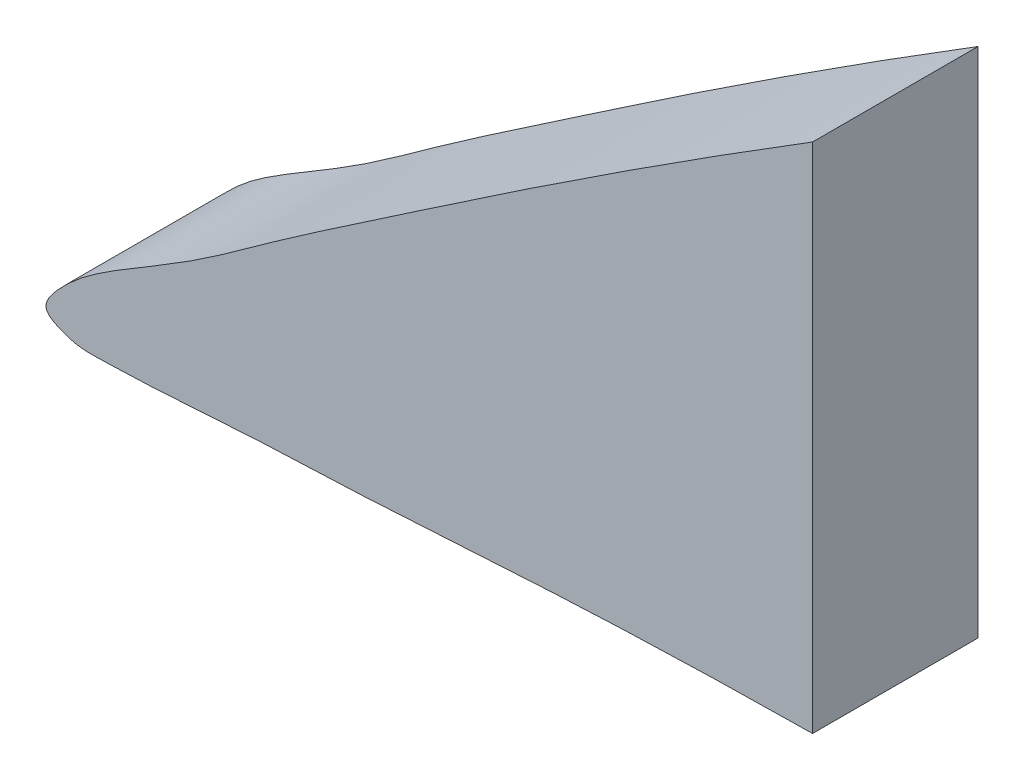
ISO-10303-21;
HEADER;
FILE_DESCRIPTION(('STEP AP214'),'2;1');
FILE_NAME('part.step','',(''),(''),'','','');
FILE_SCHEMA(('AUTOMOTIVE_DESIGN { 1 0 10303 214 1 1 1 1 }'));
ENDSEC;
DATA;
#1=APPLICATION_CONTEXT('core data for automotive mechanical design processes');
#2=APPLICATION_PROTOCOL_DEFINITION('international standard','automotive_design',2000,#1);
#3=PRODUCT_CONTEXT('',#1,'mechanical');
#4=PRODUCT('Part','Part','',(#3));
#5=PRODUCT_RELATED_PRODUCT_CATEGORY('part','',(#4));
#6=PRODUCT_DEFINITION_FORMATION('','',#4);
#7=PRODUCT_DEFINITION_CONTEXT('part definition',#1,'design');
#8=PRODUCT_DEFINITION('design','',#6,#7);
#9=PRODUCT_DEFINITION_SHAPE('','',#8);
#10=(LENGTH_UNIT() NAMED_UNIT(*) SI_UNIT(.MILLI.,.METRE.));
#11=(NAMED_UNIT(*) PLANE_ANGLE_UNIT() SI_UNIT($,.RADIAN.));
#12=(NAMED_UNIT(*) SI_UNIT($,.STERADIAN.) SOLID_ANGLE_UNIT());
#13=UNCERTAINTY_MEASURE_WITH_UNIT(LENGTH_MEASURE(1.E-05),#10,'distance_accuracy_value','');
#14=(GEOMETRIC_REPRESENTATION_CONTEXT(3) GLOBAL_UNCERTAINTY_ASSIGNED_CONTEXT((#13)) GLOBAL_UNIT_ASSIGNED_CONTEXT((#10,
#11,#12)) REPRESENTATION_CONTEXT('',''));
#15=CARTESIAN_POINT('',(0.,0.,0.));
#16=DIRECTION('',(0.,0.,1.));
#17=DIRECTION('',(1.,0.,0.));
#18=AXIS2_PLACEMENT_3D('',#15,#16,#17);
#19=CARTESIAN_POINT('',(-56.6234917582829,-97.9608096333666,67.9999999999997));
#20=CARTESIAN_POINT('',(-59.5744915806248,-99.7836436290035,67.9999999999997));
#21=CARTESIAN_POINT('',(-62.5021376636492,-101.643507558397,67.9999999999997));
#22=CARTESIAN_POINT('',(-66.86647201688,-104.476328630179,67.9999999999997));
#23=CARTESIAN_POINT('',(-68.3164332222966,-105.428019009509,67.9999999999997));
#24=CARTESIAN_POINT('',(-71.2051805666868,-107.34829764455,67.9999999999997));
#25=CARTESIAN_POINT('',(-72.6434915916945,-108.317496479384,67.9999999999997));
#26=CARTESIAN_POINT('',(-75.5157370914429,-110.262356447695,67.9999999999997));
#27=CARTESIAN_POINT('',(-76.9513853653781,-111.235489134058,67.9999999999997));
#28=CARTESIAN_POINT('',(-79.8212550175027,-113.183830597098,67.9999999999997));
#29=CARTESIAN_POINT('',(-81.2545367426772,-114.160416927023,67.9999999999997));
#30=CARTESIAN_POINT('',(-83.3775237699478,-115.664656086803,67.9999999999997));
#31=CARTESIAN_POINT('',(-84.0787918804106,-116.175740459933,67.9999999999997));
#32=CARTESIAN_POINT('',(-85.4940295082313,-117.178623737993,67.9999999999997));
#33=CARTESIAN_POINT('',(-86.2097999250049,-117.667644682045,67.9999999999997));
#34=CARTESIAN_POINT('',(-87.6711177567433,-118.600315001136,67.9999999999997));
#35=CARTESIAN_POINT('',(-88.4156813395914,-119.045463452961,67.9999999999997));
#36=CARTESIAN_POINT('',(-89.90651484269,-119.933160389862,67.9999999999997));
#37=CARTESIAN_POINT('',(-90.6528988314905,-120.37553506732,67.9999999999997));
#38=CARTESIAN_POINT('',(-91.7178541938546,-121.122323178092,67.9999999999997));
#39=CARTESIAN_POINT('',(-92.0610829880129,-121.38505757156,67.9999999999997));
#40=CARTESIAN_POINT('',(-92.7068696513712,-121.954560208893,67.9999999999997));
#41=CARTESIAN_POINT('',(-93.0136428003093,-122.257084977837,67.9999999999997));
#42=CARTESIAN_POINT('',(-93.3602862890812,-122.675840405858,67.9999999999997));
#43=CARTESIAN_POINT('',(-93.4274475093935,-122.762032978537,67.9999999999997));
#44=CARTESIAN_POINT('',(-93.5495582666548,-122.941327186733,67.9999999999997));
#45=CARTESIAN_POINT('',(-93.606126819416,-123.033797967433,67.9999999999997));
#46=CARTESIAN_POINT('',(-93.6907196604673,-123.236703179316,67.9999999999997));
#47=CARTESIAN_POINT('',(-93.716427792335,-123.348385745422,67.9999999999997));
#48=CARTESIAN_POINT('',(-93.6667845191537,-123.563802747294,67.9999999999997));
#49=CARTESIAN_POINT('',(-93.5916632018669,-123.651974656592,67.9999999999997));
#50=CARTESIAN_POINT('',(-93.422645771388,-123.792515955856,67.9999999999997));
#51=CARTESIAN_POINT('',(-93.3278627004112,-123.847783157767,67.9999999999997));
#52=CARTESIAN_POINT('',(-93.1323121417001,-123.94705295179,67.9999999999997));
#53=CARTESIAN_POINT('',(-93.0320919841695,-123.989946751266,67.9999999999997));
#54=CARTESIAN_POINT('',(-92.7278261731363,-124.108687393408,67.9999999999997));
#55=CARTESIAN_POINT('',(-92.5188733997911,-124.17430616941,67.9999999999997));
#56=CARTESIAN_POINT('',(-92.0926553255362,-124.268478418459,67.9999999999997));
#57=CARTESIAN_POINT('',(-91.8799360170612,-124.288685814427,67.9999999999997));
#58=CARTESIAN_POINT('',(-91.4549522456914,-124.29773090641,67.9999999999997));
#59=CARTESIAN_POINT('',(-91.2426280334319,-124.290689384796,67.9999999999997));
#60=CARTESIAN_POINT('',(-90.6056091095707,-124.272757138284,67.9999999999997));
#61=CARTESIAN_POINT('',(-90.1809225773565,-124.261302299015,67.9999999999997));
#62=CARTESIAN_POINT('',(-89.3316135123921,-124.233978718125,67.9999999999997));
#63=CARTESIAN_POINT('',(-88.9069922836724,-124.218020040379,67.9999999999997));
#64=CARTESIAN_POINT('',(-88.0579244808242,-124.174057141607,67.9999999999997));
#65=CARTESIAN_POINT('',(-87.6334474996334,-124.146554797078,67.9999999999997));
#66=CARTESIAN_POINT('',(-86.3602715400733,-124.059264188786,67.9999999999997));
#67=CARTESIAN_POINT('',(-85.5116897486167,-123.997215002471,67.9999999999997));
#68=CARTESIAN_POINT('',(-83.8134064704364,-123.894468358291,67.9999999999997));
#69=CARTESIAN_POINT('',(-82.963801308466,-123.851934061389,67.9999999999997));
#70=CARTESIAN_POINT('',(-81.2639710236446,-123.77868764525,67.9999999999997));
#71=CARTESIAN_POINT('',(-80.4137770279068,-123.747381955876,67.9999999999997));
#72=CARTESIAN_POINT('',(-78.713836212452,-123.676243273991,67.9999999999997));
#73=CARTESIAN_POINT('',(-77.8642011120687,-123.634027615639,67.9999999999997));
#74=CARTESIAN_POINT('',(-75.3163570264688,-123.489541681333,67.9999999999997));
#75=CARTESIAN_POINT('',(-73.6187926899221,-123.376515426061,67.9999999999997));
#76=CARTESIAN_POINT('',(-70.2224002284874,-123.171605184888,67.9999999999997));
#77=CARTESIAN_POINT('',(-68.523543254413,-123.079984707617,67.9999999999997));
#78=CARTESIAN_POINT('',(-63.4256916127023,-122.8597232535,67.9999999999997));
#79=CARTESIAN_POINT('',(-60.0252446383314,-122.776895756276,67.9999999999997));
#80=CARTESIAN_POINT('',(-56.6234917582631,-122.738552597859,67.9999999999997));
#81=B_SPLINE_CURVE_WITH_KNOTS('',3,(#19,#20,#21,#22,#23,#24,#25,#26,#27,#28,#29,#30,#31,#32,#33,
#34,#35,#36,#37,#38,#39,#40,#41,#42,#43,#44,#45,#46,#47,#48,#49,#50,#51,#52,#53,#54,#55,#56,#57,
#58,#59,#60,#61,#62,#63,#64,#65,#66,#67,#68,#69,#70,#71,#72,#73,#74,#75,#76,#77,#78,#79,#80),
.UNSPECIFIED.,.F.,.F.,(4,2,2,2,2,2,2,2,2,2,2,2,2,2,2,2,2,2,2,2,2,2,2,2,2,2,2,2,2,2,4),(0.,
0.125000000000001,0.187500000000001,0.250000000000001,0.312500000000001,0.375000000000001,
0.406250000000001,0.437500000000001,0.468750000000001,0.500000000000001,0.515625000000002,
0.531250000000002,0.535156250000002,0.539062500000001,0.542968750000001,0.546875000000001,
0.550781250000001,0.5546875,0.5625,0.5703125,0.578125000000001,0.593750000000001,
0.609375000000001,0.625000000000001,0.656250000000001,0.6875,0.71875,0.75,0.8125,0.875,1.),.UNSPECIFIED.);
#82=DIRECTION('',(0.,0.,-1.));
#83=VECTOR('',#82,1.);
#84=SURFACE_OF_LINEAR_EXTRUSION('',#81,#83);
#85=CARTESIAN_POINT('',(-56.6234917582829,-97.9608096333666,59.9999999999998));
#86=CARTESIAN_POINT('',(-59.5744915806248,-99.7836436290035,59.9999999999998));
#87=CARTESIAN_POINT('',(-62.5021376636492,-101.643507558397,59.9999999999998));
#88=CARTESIAN_POINT('',(-66.86647201688,-104.476328630179,59.9999999999998));
#89=CARTESIAN_POINT('',(-68.3164332222966,-105.428019009509,59.9999999999998));
#90=CARTESIAN_POINT('',(-71.2051805666868,-107.34829764455,59.9999999999998));
#91=CARTESIAN_POINT('',(-72.6434915916945,-108.317496479384,59.9999999999998));
#92=CARTESIAN_POINT('',(-75.5157370914429,-110.262356447695,59.9999999999998));
#93=CARTESIAN_POINT('',(-76.9513853653781,-111.235489134058,59.9999999999998));
#94=CARTESIAN_POINT('',(-79.8212550175027,-113.183830597098,59.9999999999998));
#95=CARTESIAN_POINT('',(-81.2545367426772,-114.160416927023,59.9999999999998));
#96=CARTESIAN_POINT('',(-83.3775237699478,-115.664656086803,59.9999999999998));
#97=CARTESIAN_POINT('',(-84.0787918804106,-116.175740459933,59.9999999999998));
#98=CARTESIAN_POINT('',(-85.4940295082313,-117.178623737993,59.9999999999998));
#99=CARTESIAN_POINT('',(-86.2097999250049,-117.667644682045,59.9999999999998));
#100=CARTESIAN_POINT('',(-87.6711177567433,-118.600315001136,59.9999999999998));
#101=CARTESIAN_POINT('',(-88.4156813395914,-119.045463452961,59.9999999999998));
#102=CARTESIAN_POINT('',(-89.90651484269,-119.933160389862,59.9999999999998));
#103=CARTESIAN_POINT('',(-90.6528988314905,-120.37553506732,59.9999999999998));
#104=CARTESIAN_POINT('',(-91.7178541938546,-121.122323178092,59.9999999999998));
#105=CARTESIAN_POINT('',(-92.0610829880129,-121.38505757156,59.9999999999998));
#106=CARTESIAN_POINT('',(-92.7068696513712,-121.954560208893,59.9999999999998));
#107=CARTESIAN_POINT('',(-93.0136428003093,-122.257084977837,59.9999999999998));
#108=CARTESIAN_POINT('',(-93.3602862890812,-122.675840405858,59.9999999999998));
#109=CARTESIAN_POINT('',(-93.4274475093935,-122.762032978537,59.9999999999998));
#110=CARTESIAN_POINT('',(-93.5495582666548,-122.941327186733,59.9999999999998));
#111=CARTESIAN_POINT('',(-93.606126819416,-123.033797967433,59.9999999999998));
#112=CARTESIAN_POINT('',(-93.6907196604673,-123.236703179316,59.9999999999998));
#113=CARTESIAN_POINT('',(-93.716427792335,-123.348385745422,59.9999999999998));
#114=CARTESIAN_POINT('',(-93.6667845191537,-123.563802747294,59.9999999999998));
#115=CARTESIAN_POINT('',(-93.5916632018669,-123.651974656592,59.9999999999998));
#116=CARTESIAN_POINT('',(-93.422645771388,-123.792515955856,59.9999999999998));
#117=CARTESIAN_POINT('',(-93.3278627004112,-123.847783157767,59.9999999999998));
#118=CARTESIAN_POINT('',(-93.1323121417001,-123.94705295179,59.9999999999998));
#119=CARTESIAN_POINT('',(-93.0320919841695,-123.989946751266,59.9999999999998));
#120=CARTESIAN_POINT('',(-92.7278261731363,-124.108687393408,59.9999999999998));
#121=CARTESIAN_POINT('',(-92.5188733997911,-124.17430616941,59.9999999999998));
#122=CARTESIAN_POINT('',(-92.0926553255362,-124.268478418459,59.9999999999998));
#123=CARTESIAN_POINT('',(-91.8799360170612,-124.288685814427,59.9999999999998));
#124=CARTESIAN_POINT('',(-91.4549522456914,-124.29773090641,59.9999999999998));
#125=CARTESIAN_POINT('',(-91.2426280334319,-124.290689384796,59.9999999999998));
#126=CARTESIAN_POINT('',(-90.6056091095707,-124.272757138284,59.9999999999998));
#127=CARTESIAN_POINT('',(-90.1809225773565,-124.261302299015,59.9999999999998));
#128=CARTESIAN_POINT('',(-89.3316135123921,-124.233978718125,59.9999999999998));
#129=CARTESIAN_POINT('',(-88.9069922836724,-124.218020040379,59.9999999999998));
#130=CARTESIAN_POINT('',(-88.0579244808242,-124.174057141607,59.9999999999998));
#131=CARTESIAN_POINT('',(-87.6334474996334,-124.146554797078,59.9999999999998));
#132=CARTESIAN_POINT('',(-86.3602715400733,-124.059264188786,59.9999999999998));
#133=CARTESIAN_POINT('',(-85.5116897486167,-123.997215002471,59.9999999999998));
#134=CARTESIAN_POINT('',(-83.8134064704364,-123.894468358291,59.9999999999998));
#135=CARTESIAN_POINT('',(-82.963801308466,-123.851934061389,59.9999999999998));
#136=CARTESIAN_POINT('',(-81.2639710236446,-123.77868764525,59.9999999999998));
#137=CARTESIAN_POINT('',(-80.4137770279068,-123.747381955876,59.9999999999998));
#138=CARTESIAN_POINT('',(-78.713836212452,-123.676243273991,59.9999999999998));
#139=CARTESIAN_POINT('',(-77.8642011120687,-123.634027615639,59.9999999999998));
#140=CARTESIAN_POINT('',(-75.3163570264688,-123.489541681333,59.9999999999998));
#141=CARTESIAN_POINT('',(-73.6187926899221,-123.376515426061,59.9999999999998));
#142=CARTESIAN_POINT('',(-70.2224002284874,-123.171605184888,59.9999999999998));
#143=CARTESIAN_POINT('',(-68.523543254413,-123.079984707617,59.9999999999998));
#144=CARTESIAN_POINT('',(-63.4256916127023,-122.8597232535,59.9999999999998));
#145=CARTESIAN_POINT('',(-60.0252446383314,-122.776895756276,59.9999999999998));
#146=CARTESIAN_POINT('',(-56.6234917582631,-122.738552597859,59.9999999999998));
#147=B_SPLINE_CURVE_WITH_KNOTS('',3,(#85,#86,#87,#88,#89,#90,#91,#92,#93,#94,#95,#96,#97,#98,
#99,#100,#101,#102,#103,#104,#105,#106,#107,#108,#109,#110,#111,#112,#113,#114,#115,#116,#117,
#118,#119,#120,#121,#122,#123,#124,#125,#126,#127,#128,#129,#130,#131,#132,#133,#134,#135,#136,
#137,#138,#139,#140,#141,#142,#143,#144,#145,#146),.UNSPECIFIED.,.F.,.F.,(4,2,2,2,2,2,2,2,2,2,2,
2,2,2,2,2,2,2,2,2,2,2,2,2,2,2,2,2,2,2,4),(0.,0.125000000000001,0.187500000000001,
0.250000000000001,0.312500000000001,0.375000000000001,0.406250000000001,0.437500000000001,
0.468750000000001,0.500000000000001,0.515625000000002,0.531250000000002,0.535156250000002,
0.539062500000001,0.542968750000001,0.546875000000001,0.550781250000001,0.5546875,0.5625,
0.5703125,0.578125000000001,0.593750000000001,0.609375000000001,0.625000000000001,
0.656250000000001,0.6875,0.71875,0.75,0.8125,0.875,1.),.UNSPECIFIED.);
#148=CARTESIAN_POINT('',(-56.6234917582641,-97.9608096333558,59.9999999999997));
#149=VERTEX_POINT('',#148);
#150=CARTESIAN_POINT('',(-56.6234917582631,-122.738552597859,59.9999999999997));
#151=VERTEX_POINT('',#150);
#152=EDGE_CURVE('E65',#149,#151,#147,.T.);
#153=ORIENTED_EDGE('',*,*,#152,.T.);
#154=DIRECTION('',(0.,0.,-1.));
#155=VECTOR('',#154,1.);
#156=CARTESIAN_POINT('',(-56.6234917582631,-122.738552597859,67.9999999999997));
#157=LINE('',#156,#155);
#158=CARTESIAN_POINT('',(-56.6234917582631,-122.738552597859,67.9999999999997));
#159=VERTEX_POINT('',#158);
#160=EDGE_CURVE('E11',#159,#151,#157,.T.);
#161=ORIENTED_EDGE('',*,*,#160,.F.);
#162=CARTESIAN_POINT('',(-56.6234917582631,-122.738552597859,67.9999999999997));
#163=CARTESIAN_POINT('',(-60.0252446383314,-122.776895756276,67.9999999999997));
#164=CARTESIAN_POINT('',(-63.4256916127023,-122.8597232535,67.9999999999997));
#165=CARTESIAN_POINT('',(-68.523543254413,-123.079984707617,67.9999999999997));
#166=CARTESIAN_POINT('',(-70.2224002284874,-123.171605184888,67.9999999999997));
#167=CARTESIAN_POINT('',(-73.6187926899221,-123.376515426061,67.9999999999997));
#168=CARTESIAN_POINT('',(-75.3163570264688,-123.489541681333,67.9999999999997));
#169=CARTESIAN_POINT('',(-77.8642011120687,-123.634027615639,67.9999999999997));
#170=CARTESIAN_POINT('',(-78.713836212452,-123.676243273991,67.9999999999997));
#171=CARTESIAN_POINT('',(-80.4137770279068,-123.747381955876,67.9999999999997));
#172=CARTESIAN_POINT('',(-81.2639710236446,-123.77868764525,67.9999999999997));
#173=CARTESIAN_POINT('',(-82.963801308466,-123.851934061389,67.9999999999997));
#174=CARTESIAN_POINT('',(-83.8134064704364,-123.894468358291,67.9999999999997));
#175=CARTESIAN_POINT('',(-85.5116897486167,-123.997215002471,67.9999999999997));
#176=CARTESIAN_POINT('',(-86.3602715400733,-124.059264188786,67.9999999999997));
#177=CARTESIAN_POINT('',(-87.6334474996334,-124.146554797078,67.9999999999997));
#178=CARTESIAN_POINT('',(-88.0579244808242,-124.174057141607,67.9999999999997));
#179=CARTESIAN_POINT('',(-88.9069922836724,-124.218020040379,67.9999999999997));
#180=CARTESIAN_POINT('',(-89.3316135123921,-124.233978718125,67.9999999999997));
#181=CARTESIAN_POINT('',(-90.1809225773565,-124.261302299015,67.9999999999997));
#182=CARTESIAN_POINT('',(-90.6056091095707,-124.272757138284,67.9999999999997));
#183=CARTESIAN_POINT('',(-91.2426280334319,-124.290689384796,67.9999999999997));
#184=CARTESIAN_POINT('',(-91.4549522456914,-124.29773090641,67.9999999999997));
#185=CARTESIAN_POINT('',(-91.8799360170612,-124.288685814427,67.9999999999997));
#186=CARTESIAN_POINT('',(-92.0926553255362,-124.268478418459,67.9999999999997));
#187=CARTESIAN_POINT('',(-92.5188733997911,-124.17430616941,67.9999999999997));
#188=CARTESIAN_POINT('',(-92.7278261731363,-124.108687393408,67.9999999999997));
#189=CARTESIAN_POINT('',(-93.0320919841695,-123.989946751266,67.9999999999997));
#190=CARTESIAN_POINT('',(-93.1323121417001,-123.94705295179,67.9999999999997));
#191=CARTESIAN_POINT('',(-93.3278627004112,-123.847783157767,67.9999999999997));
#192=CARTESIAN_POINT('',(-93.422645771388,-123.792515955856,67.9999999999997));
#193=CARTESIAN_POINT('',(-93.5916632018669,-123.651974656592,67.9999999999997));
#194=CARTESIAN_POINT('',(-93.6667845191537,-123.563802747294,67.9999999999997));
#195=CARTESIAN_POINT('',(-93.716427792335,-123.348385745422,67.9999999999997));
#196=CARTESIAN_POINT('',(-93.6907196604673,-123.236703179316,67.9999999999997));
#197=CARTESIAN_POINT('',(-93.606126819416,-123.033797967433,67.9999999999997));
#198=CARTESIAN_POINT('',(-93.5495582666548,-122.941327186733,67.9999999999997));
#199=CARTESIAN_POINT('',(-93.4274475093935,-122.762032978537,67.9999999999997));
#200=CARTESIAN_POINT('',(-93.3602862890812,-122.675840405858,67.9999999999997));
#201=CARTESIAN_POINT('',(-93.0136428003093,-122.257084977837,67.9999999999997));
#202=CARTESIAN_POINT('',(-92.7068696513712,-121.954560208893,67.9999999999997));
#203=CARTESIAN_POINT('',(-92.0610829880129,-121.38505757156,67.9999999999997));
#204=CARTESIAN_POINT('',(-91.7178541938546,-121.122323178092,67.9999999999997));
#205=CARTESIAN_POINT('',(-90.6528988314905,-120.37553506732,67.9999999999997));
#206=CARTESIAN_POINT('',(-89.90651484269,-119.933160389862,67.9999999999997));
#207=CARTESIAN_POINT('',(-88.4156813395914,-119.045463452961,67.9999999999997));
#208=CARTESIAN_POINT('',(-87.6711177567433,-118.600315001136,67.9999999999997));
#209=CARTESIAN_POINT('',(-86.2097999250049,-117.667644682045,67.9999999999997));
#210=CARTESIAN_POINT('',(-85.4940295082313,-117.178623737993,67.9999999999997));
#211=CARTESIAN_POINT('',(-84.0787918804106,-116.175740459933,67.9999999999997));
#212=CARTESIAN_POINT('',(-83.3775237699478,-115.664656086803,67.9999999999997));
#213=CARTESIAN_POINT('',(-81.2545367426772,-114.160416927023,67.9999999999997));
#214=CARTESIAN_POINT('',(-79.8212550175027,-113.183830597098,67.9999999999997));
#215=CARTESIAN_POINT('',(-76.9513853653781,-111.235489134058,67.9999999999997));
#216=CARTESIAN_POINT('',(-75.5157370914429,-110.262356447695,67.9999999999997));
#217=CARTESIAN_POINT('',(-72.6434915916945,-108.317496479384,67.9999999999997));
#218=CARTESIAN_POINT('',(-71.2051805666868,-107.34829764455,67.9999999999997));
#219=CARTESIAN_POINT('',(-68.3164332222966,-105.428019009509,67.9999999999997));
#220=CARTESIAN_POINT('',(-66.86647201688,-104.476328630179,67.9999999999997));
#221=CARTESIAN_POINT('',(-62.5021376636492,-101.643507558397,67.9999999999997));
#222=CARTESIAN_POINT('',(-59.5744915806248,-99.7836436290035,67.9999999999997));
#223=CARTESIAN_POINT('',(-56.6234917582829,-97.9608096333666,67.9999999999997));
#224=B_SPLINE_CURVE_WITH_KNOTS('',3,(#162,#163,#164,#165,#166,#167,#168,#169,#170,#171,#172,
#173,#174,#175,#176,#177,#178,#179,#180,#181,#182,#183,#184,#185,#186,#187,#188,#189,#190,#191,
#192,#193,#194,#195,#196,#197,#198,#199,#200,#201,#202,#203,#204,#205,#206,#207,#208,#209,#210,
#211,#212,#213,#214,#215,#216,#217,#218,#219,#220,#221,#222,#223),.UNSPECIFIED.,.F.,.F.,(4,2,2,
2,2,2,2,2,2,2,2,2,2,2,2,2,2,2,2,2,2,2,2,2,2,2,2,2,2,2,4),(0.,0.125,0.1875,0.25,0.28125,0.3125,
0.343749999999999,0.374999999999999,0.390624999999999,0.406249999999999,0.421874999999999,
0.4296875,0.4375,0.4453125,0.449218749999999,0.453124999999999,0.457031249999999,
0.460937499999999,0.464843749999998,0.468749999999998,0.484374999999998,0.499999999999999,
0.531249999999999,0.562499999999999,0.593749999999999,0.624999999999999,0.687499999999999,
0.749999999999999,0.812499999999999,0.874999999999999,1.),.UNSPECIFIED.);
#225=CARTESIAN_POINT('',(-56.6234917582641,-97.9608096333558,67.9999999999997));
#226=VERTEX_POINT('',#225);
#227=EDGE_CURVE('E64',#226,#159,#224,.F.);
#228=ORIENTED_EDGE('',*,*,#227,.F.);
#229=DIRECTION('',(0.,0.,-1.));
#230=VECTOR('',#229,1.);
#231=CARTESIAN_POINT('',(-56.6234917582641,-97.9608096333558,67.9999999999997));
#232=LINE('',#231,#230);
#233=EDGE_CURVE('E41',#226,#149,#232,.T.);
#234=ORIENTED_EDGE('',*,*,#233,.T.);
#235=EDGE_LOOP('',(#153,#161,#228,#234));
#236=FACE_BOUND('',#235,.T.);
#237=ADVANCED_FACE('F30',(#236),#84,.F.);
#238=CARTESIAN_POINT('',(-56.6234917582641,-97.9608096333558,67.9999999999997));
#239=DIRECTION('',(-1.,0.,0.));
#240=DIRECTION('',(0.,-1.,0.));
#241=AXIS2_PLACEMENT_3D('',#238,#239,#240);
#242=PLANE('',#241);
#243=DIRECTION('',(0.,1.,0.));
#244=VECTOR('',#243,1.);
#245=CARTESIAN_POINT('',(-56.6234917582641,-97.9608096333558,59.9999999999997));
#246=LINE('',#245,#244);
#247=EDGE_CURVE('E57',#151,#149,#246,.T.);
#248=ORIENTED_EDGE('',*,*,#247,.T.);
#249=ORIENTED_EDGE('',*,*,#233,.F.);
#250=DIRECTION('',(0.,1.,0.));
#251=VECTOR('',#250,1.);
#252=CARTESIAN_POINT('',(-56.6234917582641,-97.9608096333558,67.9999999999997));
#253=LINE('',#252,#251);
#254=EDGE_CURVE('E49',#159,#226,#253,.T.);
#255=ORIENTED_EDGE('',*,*,#254,.F.);
#256=ORIENTED_EDGE('',*,*,#160,.T.);
#257=EDGE_LOOP('',(#248,#249,#255,#256));
#258=FACE_BOUND('',#257,.T.);
#259=ADVANCED_FACE('F60',(#258),#242,.F.);
#260=CARTESIAN_POINT('',(-91.3628690730665,-120.873393807835,67.9999999999997));
#261=DIRECTION('',(0.,0.,-1.));
#262=DIRECTION('',(-1.,0.,0.));
#263=AXIS2_PLACEMENT_3D('',#260,#261,#262);
#264=PLANE('',#263);
#265=ORIENTED_EDGE('',*,*,#227,.T.);
#266=ORIENTED_EDGE('',*,*,#254,.T.);
#267=EDGE_LOOP('',(#265,#266));
#268=FACE_BOUND('',#267,.T.);
#269=ADVANCED_FACE('F87',(#268),#264,.F.);
#270=CARTESIAN_POINT('',(-91.3628690730665,-120.873393807835,59.9999999999997));
#271=DIRECTION('',(0.,0.,-1.));
#272=DIRECTION('',(-1.,0.,0.));
#273=AXIS2_PLACEMENT_3D('',#270,#271,#272);
#274=PLANE('',#273);
#275=ORIENTED_EDGE('',*,*,#152,.F.);
#276=ORIENTED_EDGE('',*,*,#247,.F.);
#277=EDGE_LOOP('',(#275,#276));
#278=FACE_BOUND('',#277,.T.);
#279=ADVANCED_FACE('F71',(#278),#274,.T.);
#280=CLOSED_SHELL('',(#237,#259,#269,#279));
#281=MANIFOLD_SOLID_BREP('B2',#280);
#282=ADVANCED_BREP_SHAPE_REPRESENTATION('',(#18,#281),#14);
#283=SHAPE_DEFINITION_REPRESENTATION(#9,#282);
ENDSEC;
END-ISO-10303-21;
